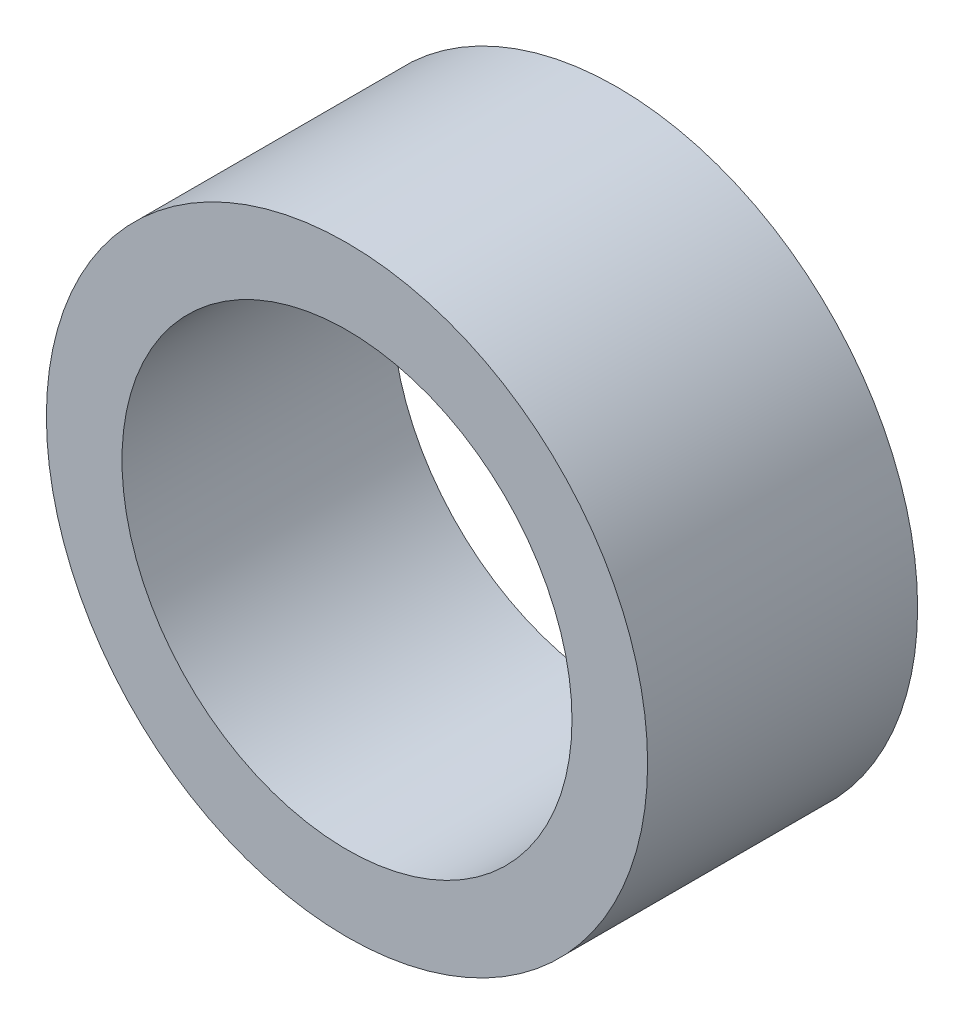
ISO-10303-21;
HEADER;
FILE_DESCRIPTION(('STEP AP214'),'2;1');
FILE_NAME('part.step','',(''),(''),'','','');
FILE_SCHEMA(('AUTOMOTIVE_DESIGN { 1 0 10303 214 1 1 1 1 }'));
ENDSEC;
DATA;
#1=APPLICATION_CONTEXT('core data for automotive mechanical design processes');
#2=APPLICATION_PROTOCOL_DEFINITION('international standard','automotive_design',2000,#1);
#3=PRODUCT_CONTEXT('',#1,'mechanical');
#4=PRODUCT('Part','Part','',(#3));
#5=PRODUCT_RELATED_PRODUCT_CATEGORY('part','',(#4));
#6=PRODUCT_DEFINITION_FORMATION('','',#4);
#7=PRODUCT_DEFINITION_CONTEXT('part definition',#1,'design');
#8=PRODUCT_DEFINITION('design','',#6,#7);
#9=PRODUCT_DEFINITION_SHAPE('','',#8);
#10=(LENGTH_UNIT() NAMED_UNIT(*) SI_UNIT(.MILLI.,.METRE.));
#11=(NAMED_UNIT(*) PLANE_ANGLE_UNIT() SI_UNIT($,.RADIAN.));
#12=(NAMED_UNIT(*) SI_UNIT($,.STERADIAN.) SOLID_ANGLE_UNIT());
#13=UNCERTAINTY_MEASURE_WITH_UNIT(LENGTH_MEASURE(1.E-05),#10,'distance_accuracy_value','');
#14=(GEOMETRIC_REPRESENTATION_CONTEXT(3) GLOBAL_UNCERTAINTY_ASSIGNED_CONTEXT((#13)) GLOBAL_UNIT_ASSIGNED_CONTEXT((#10,
#11,#12)) REPRESENTATION_CONTEXT('',''));
#15=CARTESIAN_POINT('',(0.,0.,0.));
#16=DIRECTION('',(0.,0.,1.));
#17=DIRECTION('',(1.,0.,0.));
#18=AXIS2_PLACEMENT_3D('',#15,#16,#17);
#19=CARTESIAN_POINT('',(0.,0.,-1.5));
#20=DIRECTION('',(0.,0.,1.));
#21=DIRECTION('',(1.,0.,0.));
#22=AXIS2_PLACEMENT_3D('',#19,#20,#21);
#23=CYLINDRICAL_SURFACE('',#22,2.5);
#24=CARTESIAN_POINT('',(0.,0.,1.5));
#25=DIRECTION('',(0.,0.,1.));
#26=DIRECTION('',(1.,0.,0.));
#27=AXIS2_PLACEMENT_3D('',#24,#25,#26);
#28=CIRCLE('',#27,2.5);
#29=CARTESIAN_POINT('',(2.5,0.,1.5));
#30=VERTEX_POINT('',#29);
#31=EDGE_CURVE('E18',#30,#30,#28,.F.);
#32=ORIENTED_EDGE('',*,*,#31,.F.);
#33=EDGE_LOOP('',(#32));
#34=FACE_BOUND('',#33,.T.);
#35=CARTESIAN_POINT('',(0.,0.,-1.5));
#36=DIRECTION('',(0.,0.,1.));
#37=DIRECTION('',(1.,0.,0.));
#38=AXIS2_PLACEMENT_3D('',#35,#36,#37);
#39=CIRCLE('',#38,2.5);
#40=CARTESIAN_POINT('',(2.5,0.,-1.5));
#41=VERTEX_POINT('',#40);
#42=EDGE_CURVE('E27',#41,#41,#39,.F.);
#43=ORIENTED_EDGE('',*,*,#42,.T.);
#44=EDGE_LOOP('',(#43));
#45=FACE_BOUND('',#44,.T.);
#46=ADVANCED_FACE('F15',(#34,#45),#23,.F.);
#47=CARTESIAN_POINT('',(0.,0.,1.5));
#48=DIRECTION('',(0.,0.,1.));
#49=DIRECTION('',(1.,0.,0.));
#50=AXIS2_PLACEMENT_3D('',#47,#48,#49);
#51=PLANE('',#50);
#52=ORIENTED_EDGE('',*,*,#31,.T.);
#53=EDGE_LOOP('',(#52));
#54=FACE_BOUND('',#53,.T.);
#55=CARTESIAN_POINT('',(0.,0.,1.5));
#56=DIRECTION('',(0.,0.,1.));
#57=DIRECTION('',(1.,0.,0.));
#58=AXIS2_PLACEMENT_3D('',#55,#56,#57);
#59=CIRCLE('',#58,3.34);
#60=CARTESIAN_POINT('',(3.34,0.,1.5));
#61=VERTEX_POINT('',#60);
#62=EDGE_CURVE('E22',#61,#61,#59,.F.);
#63=ORIENTED_EDGE('',*,*,#62,.F.);
#64=EDGE_LOOP('',(#63));
#65=FACE_BOUND('',#64,.T.);
#66=ADVANCED_FACE('F35',(#54,#65),#51,.T.);
#67=CARTESIAN_POINT('',(0.,0.,-1.5));
#68=DIRECTION('',(0.,0.,1.));
#69=DIRECTION('',(1.,0.,0.));
#70=AXIS2_PLACEMENT_3D('',#67,#68,#69);
#71=PLANE('',#70);
#72=ORIENTED_EDGE('',*,*,#42,.F.);
#73=EDGE_LOOP('',(#72));
#74=FACE_BOUND('',#73,.T.);
#75=CARTESIAN_POINT('',(0.,0.,-1.5));
#76=DIRECTION('',(0.,0.,1.));
#77=DIRECTION('',(1.,0.,0.));
#78=AXIS2_PLACEMENT_3D('',#75,#76,#77);
#79=CIRCLE('',#78,3.34);
#80=CARTESIAN_POINT('',(3.34,0.,-1.5));
#81=VERTEX_POINT('',#80);
#82=EDGE_CURVE('E10',#81,#81,#79,.T.);
#83=ORIENTED_EDGE('',*,*,#82,.F.);
#84=EDGE_LOOP('',(#83));
#85=FACE_BOUND('',#84,.T.);
#86=ADVANCED_FACE('F43',(#74,#85),#71,.F.);
#87=CARTESIAN_POINT('',(0.,0.,-1.5));
#88=DIRECTION('',(0.,0.,1.));
#89=DIRECTION('',(1.,0.,0.));
#90=AXIS2_PLACEMENT_3D('',#87,#88,#89);
#91=CYLINDRICAL_SURFACE('',#90,3.34);
#92=ORIENTED_EDGE('',*,*,#62,.T.);
#93=EDGE_LOOP('',(#92));
#94=FACE_BOUND('',#93,.T.);
#95=ORIENTED_EDGE('',*,*,#82,.T.);
#96=EDGE_LOOP('',(#95));
#97=FACE_BOUND('',#96,.T.);
#98=ADVANCED_FACE('F44',(#94,#97),#91,.T.);
#99=CLOSED_SHELL('',(#46,#66,#86,#98));
#100=MANIFOLD_SOLID_BREP('B1',#99);
#101=ADVANCED_BREP_SHAPE_REPRESENTATION('',(#18,#100),#14);
#102=SHAPE_DEFINITION_REPRESENTATION(#9,#101);
ENDSEC;
END-ISO-10303-21;
